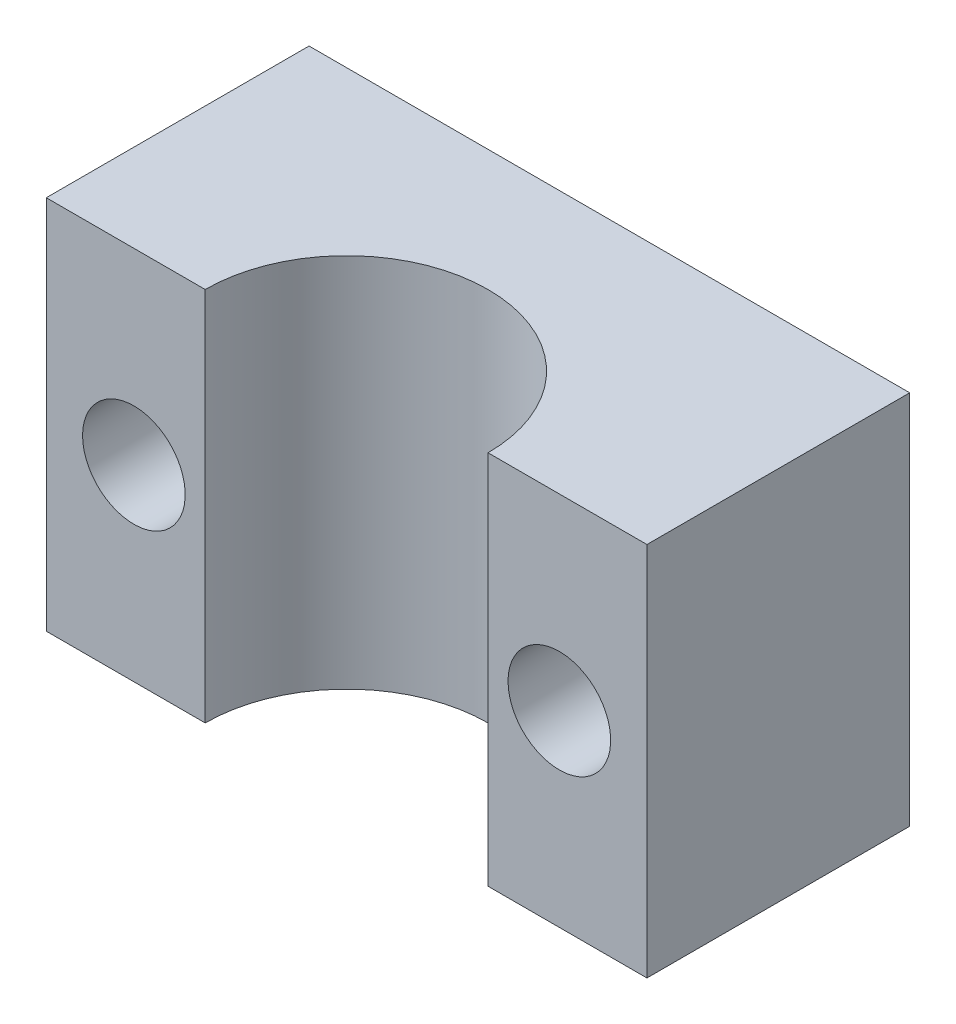
ISO-10303-21;
HEADER;
FILE_DESCRIPTION(('STEP AP214'),'2;1');
FILE_NAME('part.step','',(''),(''),'','','');
FILE_SCHEMA(('AUTOMOTIVE_DESIGN { 1 0 10303 214 1 1 1 1 }'));
ENDSEC;
DATA;
#1=APPLICATION_CONTEXT('core data for automotive mechanical design processes');
#2=APPLICATION_PROTOCOL_DEFINITION('international standard','automotive_design',2000,#1);
#3=PRODUCT_CONTEXT('',#1,'mechanical');
#4=PRODUCT('Part','Part','',(#3));
#5=PRODUCT_RELATED_PRODUCT_CATEGORY('part','',(#4));
#6=PRODUCT_DEFINITION_FORMATION('','',#4);
#7=PRODUCT_DEFINITION_CONTEXT('part definition',#1,'design');
#8=PRODUCT_DEFINITION('design','',#6,#7);
#9=PRODUCT_DEFINITION_SHAPE('','',#8);
#10=(LENGTH_UNIT() NAMED_UNIT(*) SI_UNIT(.MILLI.,.METRE.));
#11=(NAMED_UNIT(*) PLANE_ANGLE_UNIT() SI_UNIT($,.RADIAN.));
#12=(NAMED_UNIT(*) SI_UNIT($,.STERADIAN.) SOLID_ANGLE_UNIT());
#13=UNCERTAINTY_MEASURE_WITH_UNIT(LENGTH_MEASURE(1.E-05),#10,'distance_accuracy_value','');
#14=(GEOMETRIC_REPRESENTATION_CONTEXT(3) GLOBAL_UNCERTAINTY_ASSIGNED_CONTEXT((#13)) GLOBAL_UNIT_ASSIGNED_CONTEXT((#10,
#11,#12)) REPRESENTATION_CONTEXT('',''));
#15=CARTESIAN_POINT('',(0.,0.,0.));
#16=DIRECTION('',(0.,0.,1.));
#17=DIRECTION('',(1.,0.,0.));
#18=AXIS2_PLACEMENT_3D('',#15,#16,#17);
#19=CARTESIAN_POINT('',(-24.,30.,10.));
#20=DIRECTION('',(0.,0.,-1.));
#21=DIRECTION('',(-1.,0.,0.));
#22=AXIS2_PLACEMENT_3D('',#19,#20,#21);
#23=PLANE('',#22);
#24=CARTESIAN_POINT('',(17.,15.,10.));
#25=DIRECTION('',(0.,0.,-1.));
#26=DIRECTION('',(-1.,0.,0.));
#27=AXIS2_PLACEMENT_3D('',#24,#25,#26);
#28=CIRCLE('',#27,4.1);
#29=CARTESIAN_POINT('',(12.9,15.,10.));
#30=VERTEX_POINT('',#29);
#31=EDGE_CURVE('E123',#30,#30,#28,.T.);
#32=ORIENTED_EDGE('',*,*,#31,.T.);
#33=EDGE_LOOP('',(#32));
#34=FACE_BOUND('',#33,.T.);
#35=DIRECTION('',(1.,0.,0.));
#36=VECTOR('',#35,1.);
#37=CARTESIAN_POINT('',(-24.,30.,10.));
#38=LINE('',#37,#36);
#39=CARTESIAN_POINT('',(11.3,30.,10.));
#40=VERTEX_POINT('',#39);
#41=CARTESIAN_POINT('',(24.,30.,10.));
#42=VERTEX_POINT('',#41);
#43=EDGE_CURVE('E61',#40,#42,#38,.T.);
#44=ORIENTED_EDGE('',*,*,#43,.F.);
#45=DIRECTION('',(0.,1.,0.));
#46=VECTOR('',#45,1.);
#47=CARTESIAN_POINT('',(11.3,0.,10.));
#48=LINE('',#47,#46);
#49=CARTESIAN_POINT('',(11.3,0.,10.));
#50=VERTEX_POINT('',#49);
#51=EDGE_CURVE('E80',#40,#50,#48,.F.);
#52=ORIENTED_EDGE('',*,*,#51,.T.);
#53=DIRECTION('',(1.,0.,0.));
#54=VECTOR('',#53,1.);
#55=CARTESIAN_POINT('',(-24.,0.,10.));
#56=LINE('',#55,#54);
#57=CARTESIAN_POINT('',(24.,0.,10.));
#58=VERTEX_POINT('',#57);
#59=EDGE_CURVE('E75',#50,#58,#56,.T.);
#60=ORIENTED_EDGE('',*,*,#59,.T.);
#61=DIRECTION('',(0.,-1.,0.));
#62=VECTOR('',#61,1.);
#63=CARTESIAN_POINT('',(24.,30.,10.));
#64=LINE('',#63,#62);
#65=EDGE_CURVE('E45',#42,#58,#64,.T.);
#66=ORIENTED_EDGE('',*,*,#65,.F.);
#67=EDGE_LOOP('',(#44,#52,#60,#66));
#68=FACE_BOUND('',#67,.T.);
#69=ADVANCED_FACE('F37',(#34,#68),#23,.F.);
#70=CARTESIAN_POINT('',(24.,30.,10.));
#71=DIRECTION('',(-1.,0.,0.));
#72=DIRECTION('',(0.,0.,1.));
#73=AXIS2_PLACEMENT_3D('',#70,#71,#72);
#74=PLANE('',#73);
#75=DIRECTION('',(0.,0.,-1.));
#76=VECTOR('',#75,1.);
#77=CARTESIAN_POINT('',(24.,0.,10.));
#78=LINE('',#77,#76);
#79=CARTESIAN_POINT('',(24.,0.,-11.));
#80=VERTEX_POINT('',#79);
#81=EDGE_CURVE('E89',#58,#80,#78,.T.);
#82=ORIENTED_EDGE('',*,*,#81,.T.);
#83=DIRECTION('',(0.,-1.,0.));
#84=VECTOR('',#83,1.);
#85=CARTESIAN_POINT('',(24.,0.,-11.));
#86=LINE('',#85,#84);
#87=CARTESIAN_POINT('',(24.,30.,-11.));
#88=VERTEX_POINT('',#87);
#89=EDGE_CURVE('E112',#88,#80,#86,.T.);
#90=ORIENTED_EDGE('',*,*,#89,.F.);
#91=DIRECTION('',(0.,0.,-1.));
#92=VECTOR('',#91,1.);
#93=CARTESIAN_POINT('',(24.,30.,10.));
#94=LINE('',#93,#92);
#95=EDGE_CURVE('E90',#42,#88,#94,.T.);
#96=ORIENTED_EDGE('',*,*,#95,.F.);
#97=ORIENTED_EDGE('',*,*,#65,.T.);
#98=EDGE_LOOP('',(#82,#90,#96,#97));
#99=FACE_BOUND('',#98,.T.);
#100=ADVANCED_FACE('F39',(#99),#74,.F.);
#101=CARTESIAN_POINT('',(-24.,30.,10.));
#102=DIRECTION('',(1.,0.,0.));
#103=DIRECTION('',(0.,0.,-1.));
#104=AXIS2_PLACEMENT_3D('',#101,#102,#103);
#105=PLANE('',#104);
#106=DIRECTION('',(0.,0.,1.));
#107=VECTOR('',#106,1.);
#108=CARTESIAN_POINT('',(-24.,30.,10.));
#109=LINE('',#108,#107);
#110=CARTESIAN_POINT('',(-24.,30.,-11.));
#111=VERTEX_POINT('',#110);
#112=CARTESIAN_POINT('',(-24.,30.,10.));
#113=VERTEX_POINT('',#112);
#114=EDGE_CURVE('E106',#111,#113,#109,.T.);
#115=ORIENTED_EDGE('',*,*,#114,.F.);
#116=DIRECTION('',(0.,1.,0.));
#117=VECTOR('',#116,1.);
#118=CARTESIAN_POINT('',(-24.,0.,-11.));
#119=LINE('',#118,#117);
#120=CARTESIAN_POINT('',(-24.,0.,-11.));
#121=VERTEX_POINT('',#120);
#122=EDGE_CURVE('E116',#121,#111,#119,.T.);
#123=ORIENTED_EDGE('',*,*,#122,.F.);
#124=DIRECTION('',(0.,0.,1.));
#125=VECTOR('',#124,1.);
#126=CARTESIAN_POINT('',(-24.,0.,10.));
#127=LINE('',#126,#125);
#128=CARTESIAN_POINT('',(-24.,0.,10.));
#129=VERTEX_POINT('',#128);
#130=EDGE_CURVE('E84',#121,#129,#127,.T.);
#131=ORIENTED_EDGE('',*,*,#130,.T.);
#132=DIRECTION('',(0.,-1.,0.));
#133=VECTOR('',#132,1.);
#134=CARTESIAN_POINT('',(-24.,30.,10.));
#135=LINE('',#134,#133);
#136=EDGE_CURVE('E11',#113,#129,#135,.T.);
#137=ORIENTED_EDGE('',*,*,#136,.F.);
#138=EDGE_LOOP('',(#115,#123,#131,#137));
#139=FACE_BOUND('',#138,.T.);
#140=ADVANCED_FACE('F157',(#139),#105,.F.);
#141=CARTESIAN_POINT('',(-17.,15.,10.));
#142=DIRECTION('',(0.,0.,-1.));
#143=DIRECTION('',(-1.,0.,0.));
#144=AXIS2_PLACEMENT_3D('',#141,#142,#143);
#145=CIRCLE('',#144,4.1);
#146=CARTESIAN_POINT('',(-21.1,15.,10.));
#147=VERTEX_POINT('',#146);
#148=EDGE_CURVE('E119',#147,#147,#145,.T.);
#149=ORIENTED_EDGE('',*,*,#148,.T.);
#150=EDGE_LOOP('',(#149));
#151=FACE_BOUND('',#150,.T.);
#152=CARTESIAN_POINT('',(-11.3,0.,10.));
#153=VERTEX_POINT('',#152);
#154=EDGE_CURVE('E83',#129,#153,#56,.T.);
#155=ORIENTED_EDGE('',*,*,#154,.T.);
#156=DIRECTION('',(0.,1.,0.));
#157=VECTOR('',#156,1.);
#158=CARTESIAN_POINT('',(-11.3,0.,10.));
#159=LINE('',#158,#157);
#160=CARTESIAN_POINT('',(-11.3,30.,10.));
#161=VERTEX_POINT('',#160);
#162=EDGE_CURVE('E52',#153,#161,#159,.T.);
#163=ORIENTED_EDGE('',*,*,#162,.T.);
#164=EDGE_CURVE('E91',#113,#161,#38,.T.);
#165=ORIENTED_EDGE('',*,*,#164,.F.);
#166=ORIENTED_EDGE('',*,*,#136,.T.);
#167=EDGE_LOOP('',(#155,#163,#165,#166));
#168=FACE_BOUND('',#167,.T.);
#169=ADVANCED_FACE('F158',(#151,#168),#23,.F.);
#170=CARTESIAN_POINT('',(0.,30.,0.));
#171=DIRECTION('',(0.,-1.,0.));
#172=DIRECTION('',(0.,0.,-1.));
#173=AXIS2_PLACEMENT_3D('',#170,#171,#172);
#174=PLANE('',#173);
#175=ORIENTED_EDGE('',*,*,#164,.T.);
#176=CARTESIAN_POINT('',(0.,30.,10.));
#177=DIRECTION('',(0.,1.,0.));
#178=DIRECTION('',(0.,0.,1.));
#179=AXIS2_PLACEMENT_3D('',#176,#177,#178);
#180=CIRCLE('',#179,11.3);
#181=EDGE_CURVE('E134',#40,#161,#180,.T.);
#182=ORIENTED_EDGE('',*,*,#181,.F.);
#183=ORIENTED_EDGE('',*,*,#43,.T.);
#184=ORIENTED_EDGE('',*,*,#95,.T.);
#185=DIRECTION('',(1.,0.,0.));
#186=VECTOR('',#185,1.);
#187=CARTESIAN_POINT('',(10.,30.,-11.));
#188=LINE('',#187,#186);
#189=EDGE_CURVE('E99',#111,#88,#188,.T.);
#190=ORIENTED_EDGE('',*,*,#189,.F.);
#191=ORIENTED_EDGE('',*,*,#114,.T.);
#192=EDGE_LOOP('',(#175,#182,#183,#184,#190,#191));
#193=FACE_BOUND('',#192,.T.);
#194=ADVANCED_FACE('F153',(#193),#174,.F.);
#195=CARTESIAN_POINT('',(0.,0.,0.));
#196=DIRECTION('',(0.,-1.,0.));
#197=DIRECTION('',(0.,0.,-1.));
#198=AXIS2_PLACEMENT_3D('',#195,#196,#197);
#199=PLANE('',#198);
#200=CARTESIAN_POINT('',(0.,0.,10.));
#201=DIRECTION('',(0.,1.,0.));
#202=DIRECTION('',(0.,0.,1.));
#203=AXIS2_PLACEMENT_3D('',#200,#201,#202);
#204=CIRCLE('',#203,11.3);
#205=EDGE_CURVE('E133',#50,#153,#204,.T.);
#206=ORIENTED_EDGE('',*,*,#205,.T.);
#207=ORIENTED_EDGE('',*,*,#154,.F.);
#208=ORIENTED_EDGE('',*,*,#130,.F.);
#209=DIRECTION('',(1.,0.,0.));
#210=VECTOR('',#209,1.);
#211=CARTESIAN_POINT('',(10.,0.,-11.));
#212=LINE('',#211,#210);
#213=EDGE_CURVE('E96',#121,#80,#212,.T.);
#214=ORIENTED_EDGE('',*,*,#213,.T.);
#215=ORIENTED_EDGE('',*,*,#81,.F.);
#216=ORIENTED_EDGE('',*,*,#59,.F.);
#217=EDGE_LOOP('',(#206,#207,#208,#214,#215,#216));
#218=FACE_BOUND('',#217,.T.);
#219=ADVANCED_FACE('F93',(#218),#199,.T.);
#220=CARTESIAN_POINT('',(10.,0.,-11.));
#221=DIRECTION('',(0.,0.,1.));
#222=DIRECTION('',(0.,-1.,0.));
#223=AXIS2_PLACEMENT_3D('',#220,#221,#222);
#224=PLANE('',#223);
#225=CARTESIAN_POINT('',(17.,15.,-11.));
#226=DIRECTION('',(0.,0.,-1.));
#227=DIRECTION('',(-1.,0.,0.));
#228=AXIS2_PLACEMENT_3D('',#225,#226,#227);
#229=CIRCLE('',#228,4.1);
#230=CARTESIAN_POINT('',(12.9,15.,-11.));
#231=VERTEX_POINT('',#230);
#232=EDGE_CURVE('E126',#231,#231,#229,.T.);
#233=ORIENTED_EDGE('',*,*,#232,.F.);
#234=EDGE_LOOP('',(#233));
#235=FACE_BOUND('',#234,.T.);
#236=ORIENTED_EDGE('',*,*,#89,.T.);
#237=ORIENTED_EDGE('',*,*,#213,.F.);
#238=ORIENTED_EDGE('',*,*,#122,.T.);
#239=ORIENTED_EDGE('',*,*,#189,.T.);
#240=EDGE_LOOP('',(#236,#237,#238,#239));
#241=FACE_BOUND('',#240,.T.);
#242=CARTESIAN_POINT('',(-17.,15.,-11.));
#243=DIRECTION('',(0.,0.,-1.));
#244=DIRECTION('',(-1.,0.,0.));
#245=AXIS2_PLACEMENT_3D('',#242,#243,#244);
#246=CIRCLE('',#245,4.1);
#247=CARTESIAN_POINT('',(-21.1,15.,-11.));
#248=VERTEX_POINT('',#247);
#249=EDGE_CURVE('E120',#248,#248,#246,.T.);
#250=ORIENTED_EDGE('',*,*,#249,.F.);
#251=EDGE_LOOP('',(#250));
#252=FACE_BOUND('',#251,.T.);
#253=ADVANCED_FACE('F148',(#235,#241,#252),#224,.F.);
#254=CARTESIAN_POINT('',(-17.,15.,10.));
#255=DIRECTION('',(0.,0.,-1.));
#256=DIRECTION('',(-1.,0.,0.));
#257=AXIS2_PLACEMENT_3D('',#254,#255,#256);
#258=CYLINDRICAL_SURFACE('',#257,4.1);
#259=ORIENTED_EDGE('',*,*,#148,.F.);
#260=EDGE_LOOP('',(#259));
#261=FACE_BOUND('',#260,.T.);
#262=ORIENTED_EDGE('',*,*,#249,.T.);
#263=EDGE_LOOP('',(#262));
#264=FACE_BOUND('',#263,.T.);
#265=ADVANCED_FACE('F179',(#261,#264),#258,.F.);
#266=CARTESIAN_POINT('',(17.,15.,10.));
#267=DIRECTION('',(0.,0.,-1.));
#268=DIRECTION('',(-1.,0.,0.));
#269=AXIS2_PLACEMENT_3D('',#266,#267,#268);
#270=CYLINDRICAL_SURFACE('',#269,4.1);
#271=ORIENTED_EDGE('',*,*,#31,.F.);
#272=EDGE_LOOP('',(#271));
#273=FACE_BOUND('',#272,.T.);
#274=ORIENTED_EDGE('',*,*,#232,.T.);
#275=EDGE_LOOP('',(#274));
#276=FACE_BOUND('',#275,.T.);
#277=ADVANCED_FACE('F176',(#273,#276),#270,.F.);
#278=CARTESIAN_POINT('',(0.,0.,10.));
#279=DIRECTION('',(0.,1.,0.));
#280=DIRECTION('',(0.,0.,1.));
#281=AXIS2_PLACEMENT_3D('',#278,#279,#280);
#282=CYLINDRICAL_SURFACE('',#281,11.3);
#283=ORIENTED_EDGE('',*,*,#181,.T.);
#284=ORIENTED_EDGE('',*,*,#162,.F.);
#285=ORIENTED_EDGE('',*,*,#205,.F.);
#286=ORIENTED_EDGE('',*,*,#51,.F.);
#287=EDGE_LOOP('',(#283,#284,#285,#286));
#288=FACE_BOUND('',#287,.T.);
#289=ADVANCED_FACE('F136',(#288),#282,.F.);
#290=CLOSED_SHELL('',(#69,#100,#140,#169,#194,#219,#253,#265,#277,#289));
#291=MANIFOLD_SOLID_BREP('B2',#290);
#292=ADVANCED_BREP_SHAPE_REPRESENTATION('',(#18,#291),#14);
#293=SHAPE_DEFINITION_REPRESENTATION(#9,#292);
ENDSEC;
END-ISO-10303-21;
